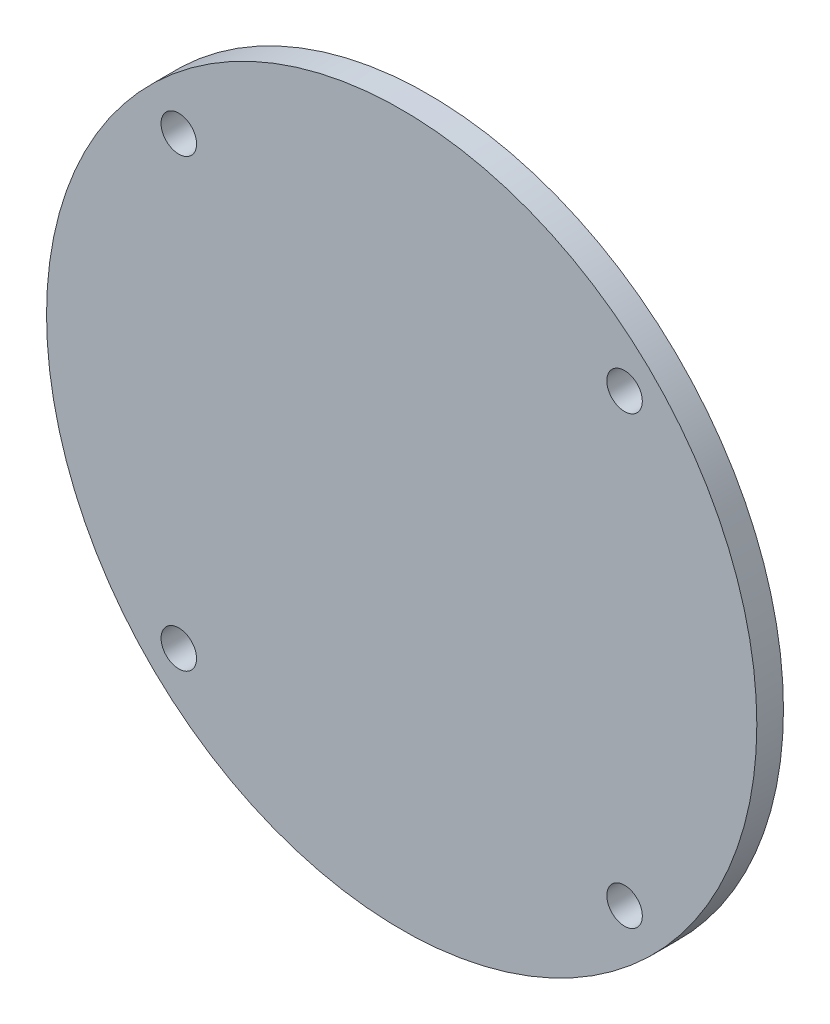
ISO-10303-21;
HEADER;
FILE_DESCRIPTION(('STEP AP214'),'2;1');
FILE_NAME('part.step','',(''),(''),'','','');
FILE_SCHEMA(('AUTOMOTIVE_DESIGN { 1 0 10303 214 1 1 1 1 }'));
ENDSEC;
DATA;
#1=APPLICATION_CONTEXT('core data for automotive mechanical design processes');
#2=APPLICATION_PROTOCOL_DEFINITION('international standard','automotive_design',2000,#1);
#3=PRODUCT_CONTEXT('',#1,'mechanical');
#4=PRODUCT('Part','Part','',(#3));
#5=PRODUCT_RELATED_PRODUCT_CATEGORY('part','',(#4));
#6=PRODUCT_DEFINITION_FORMATION('','',#4);
#7=PRODUCT_DEFINITION_CONTEXT('part definition',#1,'design');
#8=PRODUCT_DEFINITION('design','',#6,#7);
#9=PRODUCT_DEFINITION_SHAPE('','',#8);
#10=(LENGTH_UNIT() NAMED_UNIT(*) SI_UNIT(.MILLI.,.METRE.));
#11=(NAMED_UNIT(*) PLANE_ANGLE_UNIT() SI_UNIT($,.RADIAN.));
#12=(NAMED_UNIT(*) SI_UNIT($,.STERADIAN.) SOLID_ANGLE_UNIT());
#13=UNCERTAINTY_MEASURE_WITH_UNIT(LENGTH_MEASURE(1.E-05),#10,'distance_accuracy_value','');
#14=(GEOMETRIC_REPRESENTATION_CONTEXT(3) GLOBAL_UNCERTAINTY_ASSIGNED_CONTEXT((#13)) GLOBAL_UNIT_ASSIGNED_CONTEXT((#10,
#11,#12)) REPRESENTATION_CONTEXT('',''));
#15=CARTESIAN_POINT('',(0.,0.,0.));
#16=DIRECTION('',(0.,0.,1.));
#17=DIRECTION('',(1.,0.,0.));
#18=AXIS2_PLACEMENT_3D('',#15,#16,#17);
#19=CARTESIAN_POINT('',(25.1022907321224,-25.1022907321224,3.));
#20=DIRECTION('',(0.,0.,-1.));
#21=DIRECTION('',(-1.,0.,0.));
#22=AXIS2_PLACEMENT_3D('',#19,#20,#21);
#23=CYLINDRICAL_SURFACE('',#22,2.);
#24=CARTESIAN_POINT('',(25.1022907321224,-25.1022907321224,3.));
#25=DIRECTION('',(0.,0.,1.));
#26=DIRECTION('',(1.,0.,0.));
#27=AXIS2_PLACEMENT_3D('',#24,#25,#26);
#28=CIRCLE('',#27,2.);
#29=CARTESIAN_POINT('',(27.1022907321224,-25.1022907321224,3.));
#30=VERTEX_POINT('',#29);
#31=EDGE_CURVE('E47',#30,#30,#28,.T.);
#32=ORIENTED_EDGE('',*,*,#31,.T.);
#33=EDGE_LOOP('',(#32));
#34=FACE_BOUND('',#33,.T.);
#35=CARTESIAN_POINT('',(25.1022907321224,-25.1022907321224,0.));
#36=DIRECTION('',(0.,0.,1.));
#37=DIRECTION('',(1.,0.,0.));
#38=AXIS2_PLACEMENT_3D('',#35,#36,#37);
#39=CIRCLE('',#38,2.);
#40=CARTESIAN_POINT('',(27.1022907321224,-25.1022907321224,0.));
#41=VERTEX_POINT('',#40);
#42=EDGE_CURVE('E69',#41,#41,#39,.T.);
#43=ORIENTED_EDGE('',*,*,#42,.F.);
#44=EDGE_LOOP('',(#43));
#45=FACE_BOUND('',#44,.T.);
#46=ADVANCED_FACE('F41',(#34,#45),#23,.F.);
#47=CARTESIAN_POINT('',(-25.1022907321224,-25.1022907321224,3.));
#48=DIRECTION('',(0.,0.,-1.));
#49=DIRECTION('',(-1.,0.,0.));
#50=AXIS2_PLACEMENT_3D('',#47,#48,#49);
#51=CYLINDRICAL_SURFACE('',#50,2.);
#52=CARTESIAN_POINT('',(-25.1022907321224,-25.1022907321224,3.));
#53=DIRECTION('',(0.,0.,1.));
#54=DIRECTION('',(1.,0.,0.));
#55=AXIS2_PLACEMENT_3D('',#52,#53,#54);
#56=CIRCLE('',#55,2.);
#57=CARTESIAN_POINT('',(-23.1022907321224,-25.1022907321224,3.));
#58=VERTEX_POINT('',#57);
#59=EDGE_CURVE('E53',#58,#58,#56,.T.);
#60=ORIENTED_EDGE('',*,*,#59,.T.);
#61=EDGE_LOOP('',(#60));
#62=FACE_BOUND('',#61,.T.);
#63=CARTESIAN_POINT('',(-25.1022907321224,-25.1022907321224,0.));
#64=DIRECTION('',(0.,0.,1.));
#65=DIRECTION('',(1.,0.,0.));
#66=AXIS2_PLACEMENT_3D('',#63,#64,#65);
#67=CIRCLE('',#66,2.);
#68=CARTESIAN_POINT('',(-23.1022907321224,-25.1022907321224,0.));
#69=VERTEX_POINT('',#68);
#70=EDGE_CURVE('E63',#69,#69,#67,.T.);
#71=ORIENTED_EDGE('',*,*,#70,.F.);
#72=EDGE_LOOP('',(#71));
#73=FACE_BOUND('',#72,.T.);
#74=ADVANCED_FACE('F83',(#62,#73),#51,.F.);
#75=CARTESIAN_POINT('',(25.1022907321224,25.1022907321224,3.));
#76=DIRECTION('',(0.,0.,-1.));
#77=DIRECTION('',(-1.,0.,0.));
#78=AXIS2_PLACEMENT_3D('',#75,#76,#77);
#79=CYLINDRICAL_SURFACE('',#78,2.);
#80=CARTESIAN_POINT('',(25.1022907321224,25.1022907321224,3.));
#81=DIRECTION('',(0.,0.,1.));
#82=DIRECTION('',(1.,0.,0.));
#83=AXIS2_PLACEMENT_3D('',#80,#81,#82);
#84=CIRCLE('',#83,2.);
#85=CARTESIAN_POINT('',(27.1022907321224,25.1022907321224,3.));
#86=VERTEX_POINT('',#85);
#87=EDGE_CURVE('E74',#86,#86,#84,.T.);
#88=ORIENTED_EDGE('',*,*,#87,.T.);
#89=EDGE_LOOP('',(#88));
#90=FACE_BOUND('',#89,.T.);
#91=CARTESIAN_POINT('',(25.1022907321224,25.1022907321224,0.));
#92=DIRECTION('',(0.,0.,1.));
#93=DIRECTION('',(1.,0.,0.));
#94=AXIS2_PLACEMENT_3D('',#91,#92,#93);
#95=CIRCLE('',#94,2.);
#96=CARTESIAN_POINT('',(27.1022907321224,25.1022907321224,0.));
#97=VERTEX_POINT('',#96);
#98=EDGE_CURVE('E61',#97,#97,#95,.T.);
#99=ORIENTED_EDGE('',*,*,#98,.F.);
#100=EDGE_LOOP('',(#99));
#101=FACE_BOUND('',#100,.T.);
#102=ADVANCED_FACE('F105',(#90,#101),#79,.F.);
#103=CARTESIAN_POINT('',(-25.1022907321224,25.1022907321224,3.));
#104=DIRECTION('',(0.,0.,-1.));
#105=DIRECTION('',(-1.,0.,0.));
#106=AXIS2_PLACEMENT_3D('',#103,#104,#105);
#107=CYLINDRICAL_SURFACE('',#106,2.);
#108=CARTESIAN_POINT('',(-25.1022907321224,25.1022907321224,3.));
#109=DIRECTION('',(0.,0.,1.));
#110=DIRECTION('',(1.,0.,0.));
#111=AXIS2_PLACEMENT_3D('',#108,#109,#110);
#112=CIRCLE('',#111,2.);
#113=CARTESIAN_POINT('',(-23.1022907321224,25.1022907321224,3.));
#114=VERTEX_POINT('',#113);
#115=EDGE_CURVE('E71',#114,#114,#112,.T.);
#116=ORIENTED_EDGE('',*,*,#115,.T.);
#117=EDGE_LOOP('',(#116));
#118=FACE_BOUND('',#117,.T.);
#119=CARTESIAN_POINT('',(-25.1022907321224,25.1022907321224,0.));
#120=DIRECTION('',(0.,0.,1.));
#121=DIRECTION('',(1.,0.,0.));
#122=AXIS2_PLACEMENT_3D('',#119,#120,#121);
#123=CIRCLE('',#122,2.);
#124=CARTESIAN_POINT('',(-23.1022907321224,25.1022907321224,0.));
#125=VERTEX_POINT('',#124);
#126=EDGE_CURVE('E59',#125,#125,#123,.T.);
#127=ORIENTED_EDGE('',*,*,#126,.F.);
#128=EDGE_LOOP('',(#127));
#129=FACE_BOUND('',#128,.T.);
#130=ADVANCED_FACE('F43',(#118,#129),#107,.F.);
#131=CARTESIAN_POINT('',(0.,0.,3.));
#132=DIRECTION('',(0.,0.,-1.));
#133=DIRECTION('',(-1.,0.,0.));
#134=AXIS2_PLACEMENT_3D('',#131,#132,#133);
#135=CYLINDRICAL_SURFACE('',#134,40.);
#136=CARTESIAN_POINT('',(0.,0.,3.));
#137=DIRECTION('',(0.,0.,1.));
#138=DIRECTION('',(1.,0.,0.));
#139=AXIS2_PLACEMENT_3D('',#136,#137,#138);
#140=CIRCLE('',#139,40.);
#141=CARTESIAN_POINT('',(40.,0.,3.));
#142=VERTEX_POINT('',#141);
#143=EDGE_CURVE('E10',#142,#142,#140,.T.);
#144=ORIENTED_EDGE('',*,*,#143,.F.);
#145=EDGE_LOOP('',(#144));
#146=FACE_BOUND('',#145,.T.);
#147=CARTESIAN_POINT('',(0.,0.,0.));
#148=DIRECTION('',(0.,0.,1.));
#149=DIRECTION('',(1.,0.,0.));
#150=AXIS2_PLACEMENT_3D('',#147,#148,#149);
#151=CIRCLE('',#150,40.);
#152=CARTESIAN_POINT('',(40.,0.,0.));
#153=VERTEX_POINT('',#152);
#154=EDGE_CURVE('E44',#153,#153,#151,.T.);
#155=ORIENTED_EDGE('',*,*,#154,.T.);
#156=EDGE_LOOP('',(#155));
#157=FACE_BOUND('',#156,.T.);
#158=ADVANCED_FACE('F91',(#146,#157),#135,.T.);
#159=CARTESIAN_POINT('',(0.,0.,3.));
#160=DIRECTION('',(0.,0.,1.));
#161=DIRECTION('',(1.,0.,0.));
#162=AXIS2_PLACEMENT_3D('',#159,#160,#161);
#163=PLANE('',#162);
#164=ORIENTED_EDGE('',*,*,#115,.F.);
#165=EDGE_LOOP('',(#164));
#166=FACE_BOUND('',#165,.T.);
#167=ORIENTED_EDGE('',*,*,#87,.F.);
#168=EDGE_LOOP('',(#167));
#169=FACE_BOUND('',#168,.T.);
#170=ORIENTED_EDGE('',*,*,#59,.F.);
#171=EDGE_LOOP('',(#170));
#172=FACE_BOUND('',#171,.T.);
#173=ORIENTED_EDGE('',*,*,#31,.F.);
#174=EDGE_LOOP('',(#173));
#175=FACE_BOUND('',#174,.T.);
#176=ORIENTED_EDGE('',*,*,#143,.T.);
#177=EDGE_LOOP('',(#176));
#178=FACE_BOUND('',#177,.T.);
#179=ADVANCED_FACE('F86',(#166,#169,#172,#175,#178),#163,.T.);
#180=CARTESIAN_POINT('',(0.,0.,0.));
#181=DIRECTION('',(0.,0.,1.));
#182=DIRECTION('',(1.,0.,0.));
#183=AXIS2_PLACEMENT_3D('',#180,#181,#182);
#184=PLANE('',#183);
#185=ORIENTED_EDGE('',*,*,#126,.T.);
#186=EDGE_LOOP('',(#185));
#187=FACE_BOUND('',#186,.T.);
#188=ORIENTED_EDGE('',*,*,#98,.T.);
#189=EDGE_LOOP('',(#188));
#190=FACE_BOUND('',#189,.T.);
#191=ORIENTED_EDGE('',*,*,#70,.T.);
#192=EDGE_LOOP('',(#191));
#193=FACE_BOUND('',#192,.T.);
#194=ORIENTED_EDGE('',*,*,#42,.T.);
#195=EDGE_LOOP('',(#194));
#196=FACE_BOUND('',#195,.T.);
#197=ORIENTED_EDGE('',*,*,#154,.F.);
#198=EDGE_LOOP('',(#197));
#199=FACE_BOUND('',#198,.T.);
#200=ADVANCED_FACE('F87',(#187,#190,#193,#196,#199),#184,.F.);
#201=CLOSED_SHELL('',(#46,#74,#102,#130,#158,#179,#200));
#202=MANIFOLD_SOLID_BREP('B2',#201);
#203=ADVANCED_BREP_SHAPE_REPRESENTATION('',(#18,#202),#14);
#204=SHAPE_DEFINITION_REPRESENTATION(#9,#203);
ENDSEC;
END-ISO-10303-21;
